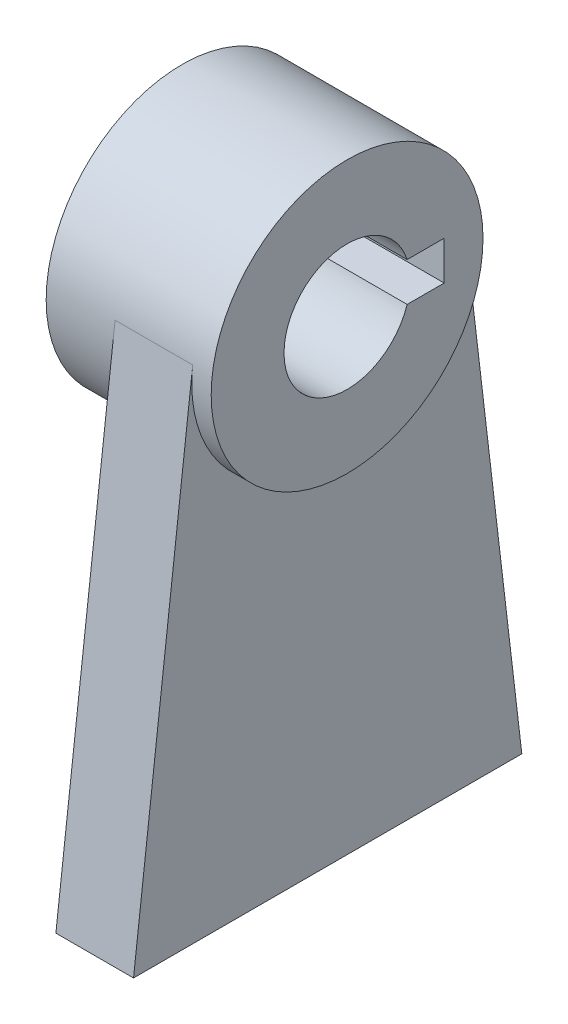
ISO-10303-21;
HEADER;
FILE_DESCRIPTION(('STEP AP214'),'2;1');
FILE_NAME('part.step','',(''),(''),'','','');
FILE_SCHEMA(('AUTOMOTIVE_DESIGN { 1 0 10303 214 1 1 1 1 }'));
ENDSEC;
DATA;
#1=APPLICATION_CONTEXT('core data for automotive mechanical design processes');
#2=APPLICATION_PROTOCOL_DEFINITION('international standard','automotive_design',2000,#1);
#3=PRODUCT_CONTEXT('',#1,'mechanical');
#4=PRODUCT('Part','Part','',(#3));
#5=PRODUCT_RELATED_PRODUCT_CATEGORY('part','',(#4));
#6=PRODUCT_DEFINITION_FORMATION('','',#4);
#7=PRODUCT_DEFINITION_CONTEXT('part definition',#1,'design');
#8=PRODUCT_DEFINITION('design','',#6,#7);
#9=PRODUCT_DEFINITION_SHAPE('','',#8);
#10=(LENGTH_UNIT() NAMED_UNIT(*) SI_UNIT(.MILLI.,.METRE.));
#11=(NAMED_UNIT(*) PLANE_ANGLE_UNIT() SI_UNIT($,.RADIAN.));
#12=(NAMED_UNIT(*) SI_UNIT($,.STERADIAN.) SOLID_ANGLE_UNIT());
#13=UNCERTAINTY_MEASURE_WITH_UNIT(LENGTH_MEASURE(1.E-05),#10,'distance_accuracy_value','');
#14=(GEOMETRIC_REPRESENTATION_CONTEXT(3) GLOBAL_UNCERTAINTY_ASSIGNED_CONTEXT((#13)) GLOBAL_UNIT_ASSIGNED_CONTEXT((#10,
#11,#12)) REPRESENTATION_CONTEXT('',''));
#15=CARTESIAN_POINT('',(0.,0.,0.));
#16=DIRECTION('',(0.,0.,1.));
#17=DIRECTION('',(1.,0.,0.));
#18=AXIS2_PLACEMENT_3D('',#15,#16,#17);
#19=CARTESIAN_POINT('',(16.,-36.,-40.));
#20=DIRECTION('',(0.,1.,0.));
#21=DIRECTION('',(0.,0.,1.));
#22=AXIS2_PLACEMENT_3D('',#19,#20,#21);
#23=PLANE('',#22);
#24=DIRECTION('',(0.,0.,-1.));
#25=VECTOR('',#24,1.);
#26=CARTESIAN_POINT('',(0.,-36.,-40.));
#27=LINE('',#26,#25);
#28=CARTESIAN_POINT('',(0.,-36.,40.));
#29=VERTEX_POINT('',#28);
#30=CARTESIAN_POINT('',(0.,-36.,-40.));
#31=VERTEX_POINT('',#30);
#32=EDGE_CURVE('E140',#29,#31,#27,.T.);
#33=ORIENTED_EDGE('',*,*,#32,.T.);
#34=DIRECTION('',(-1.,0.,0.));
#35=VECTOR('',#34,1.);
#36=CARTESIAN_POINT('',(16.,-36.,-40.));
#37=LINE('',#36,#35);
#38=CARTESIAN_POINT('',(16.,-36.,-40.));
#39=VERTEX_POINT('',#38);
#40=EDGE_CURVE('E37',#39,#31,#37,.T.);
#41=ORIENTED_EDGE('',*,*,#40,.F.);
#42=DIRECTION('',(0.,0.,-1.));
#43=VECTOR('',#42,1.);
#44=CARTESIAN_POINT('',(16.,-36.,-40.));
#45=LINE('',#44,#43);
#46=CARTESIAN_POINT('',(16.,-36.,40.));
#47=VERTEX_POINT('',#46);
#48=EDGE_CURVE('E143',#47,#39,#45,.T.);
#49=ORIENTED_EDGE('',*,*,#48,.F.);
#50=DIRECTION('',(-1.,0.,0.));
#51=VECTOR('',#50,1.);
#52=CARTESIAN_POINT('',(16.,-36.,40.));
#53=LINE('',#52,#51);
#54=EDGE_CURVE('E152',#47,#29,#53,.T.);
#55=ORIENTED_EDGE('',*,*,#54,.T.);
#56=EDGE_LOOP('',(#33,#41,#49,#55));
#57=FACE_BOUND('',#56,.T.);
#58=ADVANCED_FACE('F34',(#57),#23,.F.);
#59=CARTESIAN_POINT('',(16.,-36.,-40.));
#60=DIRECTION('',(0.,-0.117241382394366,0.993103447911776));
#61=DIRECTION('',(0.,-0.993103447911776,-0.117241382394366));
#62=AXIS2_PLACEMENT_3D('',#59,#60,#61);
#63=PLANE('',#62);
#64=DIRECTION('',(0.,0.993103447911776,0.117241382394366));
#65=VECTOR('',#64,1.);
#66=CARTESIAN_POINT('',(0.,-36.,-40.));
#67=LINE('',#66,#65);
#68=CARTESIAN_POINT('',(0.,67.2827587070422,-27.8068962163214));
#69=VERTEX_POINT('',#68);
#70=EDGE_CURVE('E155',#31,#69,#67,.T.);
#71=ORIENTED_EDGE('',*,*,#70,.T.);
#72=DIRECTION('',(-1.,0.,0.));
#73=VECTOR('',#72,1.);
#74=CARTESIAN_POINT('',(16.,67.2827587070422,-27.8068962163214));
#75=LINE('',#74,#73);
#76=CARTESIAN_POINT('',(16.,67.2827587070423,-27.8068962163214));
#77=VERTEX_POINT('',#76);
#78=EDGE_CURVE('E163',#77,#69,#75,.T.);
#79=ORIENTED_EDGE('',*,*,#78,.F.);
#80=DIRECTION('',(0.,0.993103447911776,0.117241382394366));
#81=VECTOR('',#80,1.);
#82=CARTESIAN_POINT('',(16.,-36.,-40.));
#83=LINE('',#82,#81);
#84=EDGE_CURVE('E146',#39,#77,#83,.T.);
#85=ORIENTED_EDGE('',*,*,#84,.F.);
#86=ORIENTED_EDGE('',*,*,#40,.T.);
#87=EDGE_LOOP('',(#71,#79,#85,#86));
#88=FACE_BOUND('',#87,.T.);
#89=ADVANCED_FACE('F169',(#88),#63,.F.);
#90=CARTESIAN_POINT('',(16.,64.,3.25208300393232E-07));
#91=DIRECTION('',(-1.,0.,0.));
#92=DIRECTION('',(0.,0.,1.));
#93=AXIS2_PLACEMENT_3D('',#90,#91,#92);
#94=CYLINDRICAL_SURFACE('',#93,28.);
#95=ORIENTED_EDGE('',*,*,#78,.T.);
#96=CARTESIAN_POINT('',(0.,64.,3.25208300393232E-07));
#97=DIRECTION('',(-1.,0.,0.));
#98=DIRECTION('',(0.,0.,1.));
#99=AXIS2_PLACEMENT_3D('',#96,#97,#98);
#100=CIRCLE('',#99,28.);
#101=CARTESIAN_POINT('',(0.,67.2827585343371,27.8068968871268));
#102=VERTEX_POINT('',#101);
#103=EDGE_CURVE('E11',#69,#102,#100,.T.);
#104=ORIENTED_EDGE('',*,*,#103,.T.);
#105=DIRECTION('',(-1.,0.,0.));
#106=VECTOR('',#105,1.);
#107=CARTESIAN_POINT('',(16.,67.2827585343371,27.8068968871268));
#108=LINE('',#107,#106);
#109=CARTESIAN_POINT('',(16.,67.2827585343371,27.8068968871268));
#110=VERTEX_POINT('',#109);
#111=EDGE_CURVE('E161',#110,#102,#108,.T.);
#112=ORIENTED_EDGE('',*,*,#111,.F.);
#113=CARTESIAN_POINT('',(16.,64.,3.25208300393232E-07));
#114=DIRECTION('',(1.,0.,0.));
#115=DIRECTION('',(0.,0.,-1.));
#116=AXIS2_PLACEMENT_3D('',#113,#114,#115);
#117=CIRCLE('',#116,28.);
#118=EDGE_CURVE('E42',#110,#77,#117,.T.);
#119=ORIENTED_EDGE('',*,*,#118,.T.);
#120=EDGE_LOOP('',(#95,#104,#112,#119));
#121=FACE_BOUND('',#120,.T.);
#122=CARTESIAN_POINT('',(20.,64.,3.25208300393232E-07));
#123=DIRECTION('',(1.,0.,0.));
#124=DIRECTION('',(0.,0.,-1.));
#125=AXIS2_PLACEMENT_3D('',#122,#123,#124);
#126=CIRCLE('',#125,28.);
#127=CARTESIAN_POINT('',(20.,64.,-27.9999996747917));
#128=VERTEX_POINT('',#127);
#129=EDGE_CURVE('E136',#128,#128,#126,.T.);
#130=ORIENTED_EDGE('',*,*,#129,.F.);
#131=EDGE_LOOP('',(#130));
#132=FACE_BOUND('',#131,.T.);
#133=CARTESIAN_POINT('',(-14.,64.,3.25208300393232E-07));
#134=DIRECTION('',(-1.,0.,0.));
#135=DIRECTION('',(0.,0.,1.));
#136=AXIS2_PLACEMENT_3D('',#133,#134,#135);
#137=CIRCLE('',#136,28.);
#138=CARTESIAN_POINT('',(-14.,64.,28.0000003252083));
#139=VERTEX_POINT('',#138);
#140=EDGE_CURVE('E131',#139,#139,#137,.T.);
#141=ORIENTED_EDGE('',*,*,#140,.F.);
#142=EDGE_LOOP('',(#141));
#143=FACE_BOUND('',#142,.T.);
#144=ADVANCED_FACE('F177',(#121,#132,#143),#94,.T.);
#145=CARTESIAN_POINT('',(16.,-36.,40.));
#146=DIRECTION('',(0.,-0.117241376226324,-0.993103448639948));
#147=DIRECTION('',(0.,0.993103448639948,-0.117241376226324));
#148=AXIS2_PLACEMENT_3D('',#145,#146,#147);
#149=PLANE('',#148);
#150=DIRECTION('',(0.,-0.993103448639948,0.117241376226324));
#151=VECTOR('',#150,1.);
#152=CARTESIAN_POINT('',(0.,-36.,40.));
#153=LINE('',#152,#151);
#154=EDGE_CURVE('E147',#102,#29,#153,.T.);
#155=ORIENTED_EDGE('',*,*,#154,.T.);
#156=ORIENTED_EDGE('',*,*,#54,.F.);
#157=DIRECTION('',(0.,-0.993103448639948,0.117241376226324));
#158=VECTOR('',#157,1.);
#159=CARTESIAN_POINT('',(16.,-36.,40.));
#160=LINE('',#159,#158);
#161=EDGE_CURVE('E150',#110,#47,#160,.T.);
#162=ORIENTED_EDGE('',*,*,#161,.F.);
#163=ORIENTED_EDGE('',*,*,#111,.T.);
#164=EDGE_LOOP('',(#155,#156,#162,#163));
#165=FACE_BOUND('',#164,.T.);
#166=ADVANCED_FACE('F181',(#165),#149,.F.);
#167=CARTESIAN_POINT('',(16.,64.,3.25208300393232E-07));
#168=DIRECTION('',(1.,0.,0.));
#169=DIRECTION('',(0.,0.,-1.));
#170=AXIS2_PLACEMENT_3D('',#167,#168,#169);
#171=PLANE('',#170);
#172=ORIENTED_EDGE('',*,*,#118,.F.);
#173=ORIENTED_EDGE('',*,*,#161,.T.);
#174=ORIENTED_EDGE('',*,*,#48,.T.);
#175=ORIENTED_EDGE('',*,*,#84,.T.);
#176=EDGE_LOOP('',(#172,#173,#174,#175));
#177=FACE_BOUND('',#176,.T.);
#178=ADVANCED_FACE('F183',(#177),#171,.T.);
#179=CARTESIAN_POINT('',(0.,64.,3.25208300393232E-07));
#180=DIRECTION('',(1.,0.,0.));
#181=DIRECTION('',(0.,0.,-1.));
#182=AXIS2_PLACEMENT_3D('',#179,#180,#181);
#183=PLANE('',#182);
#184=ORIENTED_EDGE('',*,*,#103,.F.);
#185=ORIENTED_EDGE('',*,*,#70,.F.);
#186=ORIENTED_EDGE('',*,*,#32,.F.);
#187=ORIENTED_EDGE('',*,*,#154,.F.);
#188=EDGE_LOOP('',(#184,#185,#186,#187));
#189=FACE_BOUND('',#188,.T.);
#190=ADVANCED_FACE('F175',(#189),#183,.F.);
#191=CARTESIAN_POINT('',(20.,64.,3.25208300393232E-07));
#192=DIRECTION('',(1.,0.,0.));
#193=DIRECTION('',(0.,0.,-1.));
#194=AXIS2_PLACEMENT_3D('',#191,#192,#193);
#195=PLANE('',#194);
#196=DIRECTION('',(0.,0.,1.));
#197=VECTOR('',#196,1.);
#198=CARTESIAN_POINT('',(20.,68.,-19.9999996747917));
#199=LINE('',#198,#197);
#200=CARTESIAN_POINT('',(20.,68.,-19.9999996747917));
#201=VERTEX_POINT('',#200);
#202=CARTESIAN_POINT('',(20.,68.,-12.3693165516447));
#203=VERTEX_POINT('',#202);
#204=EDGE_CURVE('E50',#201,#203,#199,.T.);
#205=ORIENTED_EDGE('',*,*,#204,.F.);
#206=DIRECTION('',(0.,-1.,0.));
#207=VECTOR('',#206,1.);
#208=CARTESIAN_POINT('',(20.,68.,-19.9999996747917));
#209=LINE('',#208,#207);
#210=CARTESIAN_POINT('',(20.,60.,-19.9999996747917));
#211=VERTEX_POINT('',#210);
#212=EDGE_CURVE('E116',#201,#211,#209,.T.);
#213=ORIENTED_EDGE('',*,*,#212,.T.);
#214=DIRECTION('',(0.,0.,1.));
#215=VECTOR('',#214,1.);
#216=CARTESIAN_POINT('',(20.,60.,-19.9999996747917));
#217=LINE('',#216,#215);
#218=CARTESIAN_POINT('',(20.,60.,-12.3693165516447));
#219=VERTEX_POINT('',#218);
#220=EDGE_CURVE('E119',#211,#219,#217,.T.);
#221=ORIENTED_EDGE('',*,*,#220,.T.);
#222=CARTESIAN_POINT('',(20.,64.,3.25208300393232E-07));
#223=DIRECTION('',(1.,0.,0.));
#224=DIRECTION('',(0.,0.,-1.));
#225=AXIS2_PLACEMENT_3D('',#222,#223,#224);
#226=CIRCLE('',#225,13.);
#227=EDGE_CURVE('E125',#203,#219,#226,.T.);
#228=ORIENTED_EDGE('',*,*,#227,.F.);
#229=EDGE_LOOP('',(#205,#213,#221,#228));
#230=FACE_BOUND('',#229,.T.);
#231=ORIENTED_EDGE('',*,*,#129,.T.);
#232=EDGE_LOOP('',(#231));
#233=FACE_BOUND('',#232,.T.);
#234=ADVANCED_FACE('F190',(#230,#233),#195,.T.);
#235=CARTESIAN_POINT('',(-14.,64.,3.25208300393232E-07));
#236=DIRECTION('',(-1.,0.,0.));
#237=DIRECTION('',(0.,0.,1.));
#238=AXIS2_PLACEMENT_3D('',#235,#236,#237);
#239=PLANE('',#238);
#240=DIRECTION('',(0.,0.,1.));
#241=VECTOR('',#240,1.);
#242=CARTESIAN_POINT('',(-14.,68.,-19.9999996747917));
#243=LINE('',#242,#241);
#244=CARTESIAN_POINT('',(-14.,68.,-19.9999996747917));
#245=VERTEX_POINT('',#244);
#246=CARTESIAN_POINT('',(-14.,68.,-12.3693165516447));
#247=VERTEX_POINT('',#246);
#248=EDGE_CURVE('E102',#245,#247,#243,.T.);
#249=ORIENTED_EDGE('',*,*,#248,.T.);
#250=CARTESIAN_POINT('',(-14.,64.,3.25208300393232E-07));
#251=DIRECTION('',(1.,0.,0.));
#252=DIRECTION('',(0.,0.,-1.));
#253=AXIS2_PLACEMENT_3D('',#250,#251,#252);
#254=CIRCLE('',#253,13.);
#255=CARTESIAN_POINT('',(-14.,60.,-12.3693165516447));
#256=VERTEX_POINT('',#255);
#257=EDGE_CURVE('E108',#247,#256,#254,.T.);
#258=ORIENTED_EDGE('',*,*,#257,.T.);
#259=DIRECTION('',(0.,0.,1.));
#260=VECTOR('',#259,1.);
#261=CARTESIAN_POINT('',(-14.,60.,-19.9999996747917));
#262=LINE('',#261,#260);
#263=CARTESIAN_POINT('',(-14.,60.,-19.9999996747917));
#264=VERTEX_POINT('',#263);
#265=EDGE_CURVE('E112',#264,#256,#262,.T.);
#266=ORIENTED_EDGE('',*,*,#265,.F.);
#267=DIRECTION('',(0.,-1.,0.));
#268=VECTOR('',#267,1.);
#269=CARTESIAN_POINT('',(-14.,68.,-19.9999996747917));
#270=LINE('',#269,#268);
#271=EDGE_CURVE('E105',#245,#264,#270,.T.);
#272=ORIENTED_EDGE('',*,*,#271,.F.);
#273=EDGE_LOOP('',(#249,#258,#266,#272));
#274=FACE_BOUND('',#273,.T.);
#275=ORIENTED_EDGE('',*,*,#140,.T.);
#276=EDGE_LOOP('',(#275));
#277=FACE_BOUND('',#276,.T.);
#278=ADVANCED_FACE('F114',(#274,#277),#239,.T.);
#279=CARTESIAN_POINT('',(-14.,68.,-19.9999996747917));
#280=DIRECTION('',(0.,1.,0.));
#281=DIRECTION('',(0.,0.,1.));
#282=AXIS2_PLACEMENT_3D('',#279,#280,#281);
#283=PLANE('',#282);
#284=ORIENTED_EDGE('',*,*,#204,.T.);
#285=DIRECTION('',(1.,0.,0.));
#286=VECTOR('',#285,1.);
#287=CARTESIAN_POINT('',(-14.,68.,-12.3693165516447));
#288=LINE('',#287,#286);
#289=EDGE_CURVE('E99',#247,#203,#288,.T.);
#290=ORIENTED_EDGE('',*,*,#289,.F.);
#291=ORIENTED_EDGE('',*,*,#248,.F.);
#292=DIRECTION('',(1.,0.,0.));
#293=VECTOR('',#292,1.);
#294=CARTESIAN_POINT('',(-14.,68.,-19.9999996747917));
#295=LINE('',#294,#293);
#296=EDGE_CURVE('E129',#245,#201,#295,.T.);
#297=ORIENTED_EDGE('',*,*,#296,.T.);
#298=EDGE_LOOP('',(#284,#290,#291,#297));
#299=FACE_BOUND('',#298,.T.);
#300=ADVANCED_FACE('F100',(#299),#283,.F.);
#301=CARTESIAN_POINT('',(-14.,68.,-19.9999996747917));
#302=DIRECTION('',(0.,0.,1.));
#303=DIRECTION('',(0.,-1.,0.));
#304=AXIS2_PLACEMENT_3D('',#301,#302,#303);
#305=PLANE('',#304);
#306=ORIENTED_EDGE('',*,*,#212,.F.);
#307=ORIENTED_EDGE('',*,*,#296,.F.);
#308=ORIENTED_EDGE('',*,*,#271,.T.);
#309=DIRECTION('',(1.,0.,0.));
#310=VECTOR('',#309,1.);
#311=CARTESIAN_POINT('',(-14.,60.,-19.9999996747917));
#312=LINE('',#311,#310);
#313=EDGE_CURVE('E132',#264,#211,#312,.T.);
#314=ORIENTED_EDGE('',*,*,#313,.T.);
#315=EDGE_LOOP('',(#306,#307,#308,#314));
#316=FACE_BOUND('',#315,.T.);
#317=ADVANCED_FACE('F258',(#316),#305,.T.);
#318=CARTESIAN_POINT('',(-14.,60.,-19.9999996747917));
#319=DIRECTION('',(0.,1.,0.));
#320=DIRECTION('',(0.,0.,1.));
#321=AXIS2_PLACEMENT_3D('',#318,#319,#320);
#322=PLANE('',#321);
#323=ORIENTED_EDGE('',*,*,#220,.F.);
#324=ORIENTED_EDGE('',*,*,#313,.F.);
#325=ORIENTED_EDGE('',*,*,#265,.T.);
#326=DIRECTION('',(1.,0.,0.));
#327=VECTOR('',#326,1.);
#328=CARTESIAN_POINT('',(-14.,60.,-12.3693165516447));
#329=LINE('',#328,#327);
#330=EDGE_CURVE('E58',#256,#219,#329,.T.);
#331=ORIENTED_EDGE('',*,*,#330,.T.);
#332=EDGE_LOOP('',(#323,#324,#325,#331));
#333=FACE_BOUND('',#332,.T.);
#334=ADVANCED_FACE('F267',(#333),#322,.T.);
#335=CARTESIAN_POINT('',(-14.,64.,3.25208300393232E-07));
#336=DIRECTION('',(1.,0.,0.));
#337=DIRECTION('',(0.,0.,-1.));
#338=AXIS2_PLACEMENT_3D('',#335,#336,#337);
#339=CYLINDRICAL_SURFACE('',#338,13.);
#340=ORIENTED_EDGE('',*,*,#227,.T.);
#341=ORIENTED_EDGE('',*,*,#330,.F.);
#342=ORIENTED_EDGE('',*,*,#257,.F.);
#343=ORIENTED_EDGE('',*,*,#289,.T.);
#344=EDGE_LOOP('',(#340,#341,#342,#343));
#345=FACE_BOUND('',#344,.T.);
#346=ADVANCED_FACE('F109',(#345),#339,.F.);
#347=CLOSED_SHELL('',(#58,#89,#144,#166,#178,#190,#234,#278,#300,#317,#334,#346));
#348=MANIFOLD_SOLID_BREP('B2',#347);
#349=ADVANCED_BREP_SHAPE_REPRESENTATION('',(#18,#348),#14);
#350=SHAPE_DEFINITION_REPRESENTATION(#9,#349);
ENDSEC;
END-ISO-10303-21;
